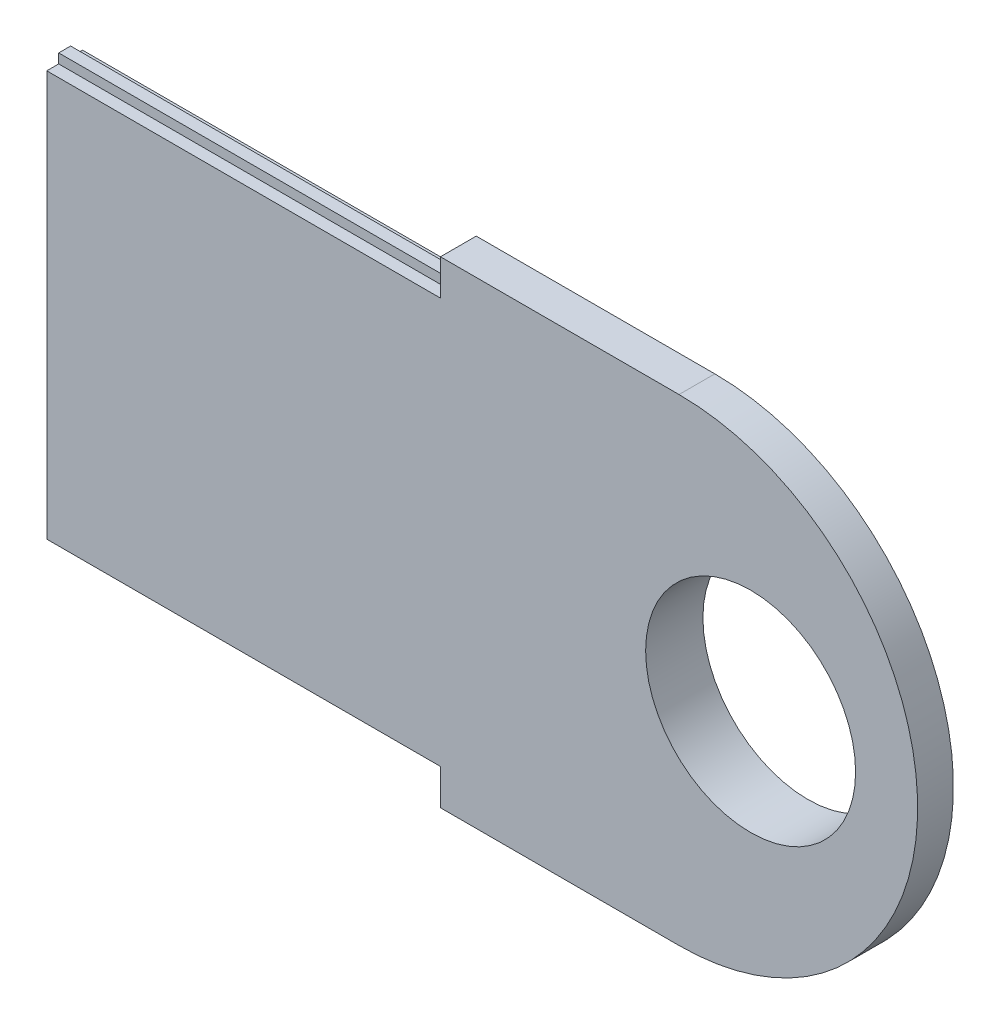
ISO-10303-21;
HEADER;
FILE_DESCRIPTION(('STEP AP214'),'2;1');
FILE_NAME('part.step','',(''),(''),'','','');
FILE_SCHEMA(('AUTOMOTIVE_DESIGN { 1 0 10303 214 1 1 1 1 }'));
ENDSEC;
DATA;
#1=APPLICATION_CONTEXT('core data for automotive mechanical design processes');
#2=APPLICATION_PROTOCOL_DEFINITION('international standard','automotive_design',2000,#1);
#3=PRODUCT_CONTEXT('',#1,'mechanical');
#4=PRODUCT('Part','Part','',(#3));
#5=PRODUCT_RELATED_PRODUCT_CATEGORY('part','',(#4));
#6=PRODUCT_DEFINITION_FORMATION('','',#4);
#7=PRODUCT_DEFINITION_CONTEXT('part definition',#1,'design');
#8=PRODUCT_DEFINITION('design','',#6,#7);
#9=PRODUCT_DEFINITION_SHAPE('','',#8);
#10=(LENGTH_UNIT() NAMED_UNIT(*) SI_UNIT(.MILLI.,.METRE.));
#11=(NAMED_UNIT(*) PLANE_ANGLE_UNIT() SI_UNIT($,.RADIAN.));
#12=(NAMED_UNIT(*) SI_UNIT($,.STERADIAN.) SOLID_ANGLE_UNIT());
#13=UNCERTAINTY_MEASURE_WITH_UNIT(LENGTH_MEASURE(1.E-05),#10,'distance_accuracy_value','');
#14=(GEOMETRIC_REPRESENTATION_CONTEXT(3) GLOBAL_UNCERTAINTY_ASSIGNED_CONTEXT((#13)) GLOBAL_UNIT_ASSIGNED_CONTEXT((#10,
#11,#12)) REPRESENTATION_CONTEXT('',''));
#15=CARTESIAN_POINT('',(0.,0.,0.));
#16=DIRECTION('',(0.,0.,1.));
#17=DIRECTION('',(1.,0.,0.));
#18=AXIS2_PLACEMENT_3D('',#15,#16,#17);
#19=CARTESIAN_POINT('',(46.355,0.,0.));
#20=DIRECTION('',(0.,0.,-1.));
#21=DIRECTION('',(-1.,0.,0.));
#22=AXIS2_PLACEMENT_3D('',#19,#20,#21);
#23=PLANE('',#22);
#24=DIRECTION('',(0.,-1.,0.));
#25=VECTOR('',#24,1.);
#26=CARTESIAN_POINT('',(-20.955,-21.59,0.));
#27=LINE('',#26,#25);
#28=CARTESIAN_POINT('',(-20.955,21.59,0.));
#29=VERTEX_POINT('',#28);
#30=CARTESIAN_POINT('',(-20.955,-21.59,0.));
#31=VERTEX_POINT('',#30);
#32=EDGE_CURVE('E215',#29,#31,#27,.T.);
#33=ORIENTED_EDGE('',*,*,#32,.F.);
#34=DIRECTION('',(-1.,0.,0.));
#35=VECTOR('',#34,1.);
#36=CARTESIAN_POINT('',(20.955,21.59,0.));
#37=LINE('',#36,#35);
#38=CARTESIAN_POINT('',(20.955,21.59,0.));
#39=VERTEX_POINT('',#38);
#40=EDGE_CURVE('E220',#39,#29,#37,.T.);
#41=ORIENTED_EDGE('',*,*,#40,.F.);
#42=DIRECTION('',(0.,-1.,0.));
#43=VECTOR('',#42,1.);
#44=CARTESIAN_POINT('',(20.955,25.4,0.));
#45=LINE('',#44,#43);
#46=CARTESIAN_POINT('',(20.955,25.4,0.));
#47=VERTEX_POINT('',#46);
#48=EDGE_CURVE('E247',#47,#39,#45,.T.);
#49=ORIENTED_EDGE('',*,*,#48,.F.);
#50=DIRECTION('',(-1.,0.,0.));
#51=VECTOR('',#50,1.);
#52=CARTESIAN_POINT('',(46.355,25.4,0.));
#53=LINE('',#52,#51);
#54=CARTESIAN_POINT('',(46.355,25.4,0.));
#55=VERTEX_POINT('',#54);
#56=EDGE_CURVE('E245',#55,#47,#53,.T.);
#57=ORIENTED_EDGE('',*,*,#56,.F.);
#58=CARTESIAN_POINT('',(46.355,0.,0.));
#59=DIRECTION('',(0.,0.,1.));
#60=DIRECTION('',(-1.,0.,0.));
#61=AXIS2_PLACEMENT_3D('',#58,#59,#60);
#62=CIRCLE('',#61,25.4);
#63=CARTESIAN_POINT('',(46.355,-25.4,0.));
#64=VERTEX_POINT('',#63);
#65=EDGE_CURVE('E243',#64,#55,#62,.T.);
#66=ORIENTED_EDGE('',*,*,#65,.F.);
#67=DIRECTION('',(1.,0.,0.));
#68=VECTOR('',#67,1.);
#69=CARTESIAN_POINT('',(46.355,-25.4,0.));
#70=LINE('',#69,#68);
#71=CARTESIAN_POINT('',(20.955,-25.4,0.));
#72=VERTEX_POINT('',#71);
#73=EDGE_CURVE('E241',#72,#64,#70,.T.);
#74=ORIENTED_EDGE('',*,*,#73,.F.);
#75=DIRECTION('',(0.,-1.,0.));
#76=VECTOR('',#75,1.);
#77=CARTESIAN_POINT('',(20.955,-25.4,0.));
#78=LINE('',#77,#76);
#79=CARTESIAN_POINT('',(20.955,-21.59,0.));
#80=VERTEX_POINT('',#79);
#81=EDGE_CURVE('E239',#80,#72,#78,.T.);
#82=ORIENTED_EDGE('',*,*,#81,.F.);
#83=DIRECTION('',(1.,0.,0.));
#84=VECTOR('',#83,1.);
#85=CARTESIAN_POINT('',(20.955,-21.59,0.));
#86=LINE('',#85,#84);
#87=EDGE_CURVE('E236',#31,#80,#86,.T.);
#88=ORIENTED_EDGE('',*,*,#87,.F.);
#89=EDGE_LOOP('',(#33,#41,#49,#57,#66,#74,#82,#88));
#90=FACE_BOUND('',#89,.T.);
#91=CARTESIAN_POINT('',(53.975,0.,0.));
#92=DIRECTION('',(0.,0.,-1.));
#93=DIRECTION('',(-1.,0.,0.));
#94=AXIS2_PLACEMENT_3D('',#91,#92,#93);
#95=CIRCLE('',#94,13.716);
#96=CARTESIAN_POINT('',(40.259,0.,0.));
#97=VERTEX_POINT('',#96);
#98=EDGE_CURVE('E386',#97,#97,#95,.T.);
#99=ORIENTED_EDGE('',*,*,#98,.F.);
#100=EDGE_LOOP('',(#99));
#101=FACE_BOUND('',#100,.T.);
#102=ADVANCED_FACE('F39',(#90,#101),#23,.T.);
#103=CARTESIAN_POINT('',(20.955,21.59,3.81));
#104=DIRECTION('',(0.,-1.,0.));
#105=DIRECTION('',(1.,0.,0.));
#106=AXIS2_PLACEMENT_3D('',#103,#104,#105);
#107=PLANE('',#106);
#108=DIRECTION('',(0.,0.,-1.));
#109=VECTOR('',#108,1.);
#110=CARTESIAN_POINT('',(20.955,21.59,3.81));
#111=LINE('',#110,#109);
#112=CARTESIAN_POINT('',(20.955,21.59,3.81));
#113=VERTEX_POINT('',#112);
#114=CARTESIAN_POINT('',(20.955,21.59,2.54));
#115=VERTEX_POINT('',#114);
#116=EDGE_CURVE('E254',#113,#115,#111,.T.);
#117=ORIENTED_EDGE('',*,*,#116,.T.);
#118=DIRECTION('',(-1.,0.,0.));
#119=VECTOR('',#118,1.);
#120=CARTESIAN_POINT('',(-20.955,21.59,2.54));
#121=LINE('',#120,#119);
#122=CARTESIAN_POINT('',(-20.955,21.59,2.54));
#123=VERTEX_POINT('',#122);
#124=EDGE_CURVE('E185',#115,#123,#121,.T.);
#125=ORIENTED_EDGE('',*,*,#124,.T.);
#126=DIRECTION('',(0.,0.,-1.));
#127=VECTOR('',#126,1.);
#128=CARTESIAN_POINT('',(-20.955,21.59,3.81));
#129=LINE('',#128,#127);
#130=CARTESIAN_POINT('',(-20.955,21.59,3.81));
#131=VERTEX_POINT('',#130);
#132=EDGE_CURVE('E161',#131,#123,#129,.T.);
#133=ORIENTED_EDGE('',*,*,#132,.F.);
#134=DIRECTION('',(-1.,0.,0.));
#135=VECTOR('',#134,1.);
#136=CARTESIAN_POINT('',(20.955,21.59,3.81));
#137=LINE('',#136,#135);
#138=EDGE_CURVE('E232',#113,#131,#137,.T.);
#139=ORIENTED_EDGE('',*,*,#138,.F.);
#140=EDGE_LOOP('',(#117,#125,#133,#139));
#141=FACE_BOUND('',#140,.T.);
#142=ADVANCED_FACE('F339',(#141),#107,.F.);
#143=CARTESIAN_POINT('',(20.955,-21.59,3.81));
#144=DIRECTION('',(0.,1.,0.));
#145=DIRECTION('',(-1.,0.,0.));
#146=AXIS2_PLACEMENT_3D('',#143,#144,#145);
#147=PLANE('',#146);
#148=DIRECTION('',(1.,0.,0.));
#149=VECTOR('',#148,1.);
#150=CARTESIAN_POINT('',(-20.955,-21.59,1.27));
#151=LINE('',#150,#149);
#152=CARTESIAN_POINT('',(-20.955,-21.59,1.27));
#153=VERTEX_POINT('',#152);
#154=CARTESIAN_POINT('',(20.955,-21.59,1.27));
#155=VERTEX_POINT('',#154);
#156=EDGE_CURVE('E165',#153,#155,#151,.T.);
#157=ORIENTED_EDGE('',*,*,#156,.F.);
#158=DIRECTION('',(0.,0.,-1.));
#159=VECTOR('',#158,1.);
#160=CARTESIAN_POINT('',(-20.955,-21.59,3.81));
#161=LINE('',#160,#159);
#162=EDGE_CURVE('E47',#153,#31,#161,.T.);
#163=ORIENTED_EDGE('',*,*,#162,.T.);
#164=ORIENTED_EDGE('',*,*,#87,.T.);
#165=DIRECTION('',(0.,0.,-1.));
#166=VECTOR('',#165,1.);
#167=CARTESIAN_POINT('',(20.955,-21.59,3.81));
#168=LINE('',#167,#166);
#169=EDGE_CURVE('E268',#155,#80,#168,.T.);
#170=ORIENTED_EDGE('',*,*,#169,.F.);
#171=EDGE_LOOP('',(#157,#163,#164,#170));
#172=FACE_BOUND('',#171,.T.);
#173=ADVANCED_FACE('F283',(#172),#147,.F.);
#174=DIRECTION('',(-1.,0.,0.));
#175=VECTOR('',#174,1.);
#176=CARTESIAN_POINT('',(-20.955,-21.59,2.54));
#177=LINE('',#176,#175);
#178=CARTESIAN_POINT('',(20.955,-21.59,2.54));
#179=VERTEX_POINT('',#178);
#180=CARTESIAN_POINT('',(-20.955,-21.59,2.54));
#181=VERTEX_POINT('',#180);
#182=EDGE_CURVE('E196',#179,#181,#177,.T.);
#183=ORIENTED_EDGE('',*,*,#182,.F.);
#184=CARTESIAN_POINT('',(20.955,-21.59,3.81));
#185=VERTEX_POINT('',#184);
#186=EDGE_CURVE('E269',#185,#179,#168,.T.);
#187=ORIENTED_EDGE('',*,*,#186,.F.);
#188=DIRECTION('',(1.,0.,0.));
#189=VECTOR('',#188,1.);
#190=CARTESIAN_POINT('',(20.955,-21.59,3.81));
#191=LINE('',#190,#189);
#192=CARTESIAN_POINT('',(-20.955,-21.59,3.81));
#193=VERTEX_POINT('',#192);
#194=EDGE_CURVE('E219',#193,#185,#191,.T.);
#195=ORIENTED_EDGE('',*,*,#194,.F.);
#196=EDGE_CURVE('E11',#193,#181,#161,.T.);
#197=ORIENTED_EDGE('',*,*,#196,.T.);
#198=EDGE_LOOP('',(#183,#187,#195,#197));
#199=FACE_BOUND('',#198,.T.);
#200=ADVANCED_FACE('F307',(#199),#147,.F.);
#201=CARTESIAN_POINT('',(20.955,-25.4,3.81));
#202=DIRECTION('',(1.,0.,0.));
#203=DIRECTION('',(0.,0.,-1.));
#204=AXIS2_PLACEMENT_3D('',#201,#202,#203);
#205=PLANE('',#204);
#206=DIRECTION('',(0.,1.,0.));
#207=VECTOR('',#206,1.);
#208=CARTESIAN_POINT('',(20.955,-22.606,1.27));
#209=LINE('',#208,#207);
#210=CARTESIAN_POINT('',(20.955,-22.606,1.27));
#211=VERTEX_POINT('',#210);
#212=EDGE_CURVE('E62',#211,#155,#209,.T.);
#213=ORIENTED_EDGE('',*,*,#212,.T.);
#214=ORIENTED_EDGE('',*,*,#169,.T.);
#215=ORIENTED_EDGE('',*,*,#81,.T.);
#216=DIRECTION('',(0.,0.,-1.));
#217=VECTOR('',#216,1.);
#218=CARTESIAN_POINT('',(20.955,-25.4,3.81));
#219=LINE('',#218,#217);
#220=CARTESIAN_POINT('',(20.955,-25.4,3.81));
#221=VERTEX_POINT('',#220);
#222=EDGE_CURVE('E266',#221,#72,#219,.T.);
#223=ORIENTED_EDGE('',*,*,#222,.F.);
#224=DIRECTION('',(0.,-1.,0.));
#225=VECTOR('',#224,1.);
#226=CARTESIAN_POINT('',(20.955,-25.4,3.81));
#227=LINE('',#226,#225);
#228=EDGE_CURVE('E222',#185,#221,#227,.T.);
#229=ORIENTED_EDGE('',*,*,#228,.F.);
#230=ORIENTED_EDGE('',*,*,#186,.T.);
#231=DIRECTION('',(0.,1.,0.));
#232=VECTOR('',#231,1.);
#233=CARTESIAN_POINT('',(20.955,-22.606,2.54));
#234=LINE('',#233,#232);
#235=CARTESIAN_POINT('',(20.955,-22.606,2.54));
#236=VERTEX_POINT('',#235);
#237=EDGE_CURVE('E207',#236,#179,#234,.T.);
#238=ORIENTED_EDGE('',*,*,#237,.F.);
#239=DIRECTION('',(0.,0.,1.));
#240=VECTOR('',#239,1.);
#241=CARTESIAN_POINT('',(20.955,-22.606,2.54));
#242=LINE('',#241,#240);
#243=EDGE_CURVE('E198',#211,#236,#242,.T.);
#244=ORIENTED_EDGE('',*,*,#243,.F.);
#245=EDGE_LOOP('',(#213,#214,#215,#223,#229,#230,#238,#244));
#246=FACE_BOUND('',#245,.T.);
#247=ADVANCED_FACE('F276',(#246),#205,.F.);
#248=CARTESIAN_POINT('',(46.355,0.,3.81));
#249=DIRECTION('',(0.,0.,-1.));
#250=DIRECTION('',(-1.,0.,0.));
#251=AXIS2_PLACEMENT_3D('',#248,#249,#250);
#252=PLANE('',#251);
#253=DIRECTION('',(0.,-1.,0.));
#254=VECTOR('',#253,1.);
#255=CARTESIAN_POINT('',(-20.955,-21.59,3.81));
#256=LINE('',#255,#254);
#257=EDGE_CURVE('E216',#131,#193,#256,.T.);
#258=ORIENTED_EDGE('',*,*,#257,.T.);
#259=ORIENTED_EDGE('',*,*,#194,.T.);
#260=ORIENTED_EDGE('',*,*,#228,.T.);
#261=DIRECTION('',(1.,0.,0.));
#262=VECTOR('',#261,1.);
#263=CARTESIAN_POINT('',(46.355,-25.4,3.81));
#264=LINE('',#263,#262);
#265=CARTESIAN_POINT('',(46.355,-25.4,3.81));
#266=VERTEX_POINT('',#265);
#267=EDGE_CURVE('E224',#221,#266,#264,.T.);
#268=ORIENTED_EDGE('',*,*,#267,.T.);
#269=CARTESIAN_POINT('',(46.355,0.,3.81));
#270=DIRECTION('',(0.,0.,1.));
#271=DIRECTION('',(-1.,0.,0.));
#272=AXIS2_PLACEMENT_3D('',#269,#270,#271);
#273=CIRCLE('',#272,25.4);
#274=CARTESIAN_POINT('',(46.355,25.4,3.81));
#275=VERTEX_POINT('',#274);
#276=EDGE_CURVE('E226',#266,#275,#273,.T.);
#277=ORIENTED_EDGE('',*,*,#276,.T.);
#278=DIRECTION('',(-1.,0.,0.));
#279=VECTOR('',#278,1.);
#280=CARTESIAN_POINT('',(46.355,25.4,3.81));
#281=LINE('',#280,#279);
#282=CARTESIAN_POINT('',(20.955,25.4,3.81));
#283=VERTEX_POINT('',#282);
#284=EDGE_CURVE('E228',#275,#283,#281,.T.);
#285=ORIENTED_EDGE('',*,*,#284,.T.);
#286=DIRECTION('',(0.,-1.,0.));
#287=VECTOR('',#286,1.);
#288=CARTESIAN_POINT('',(20.955,25.4,3.81));
#289=LINE('',#288,#287);
#290=EDGE_CURVE('E230',#283,#113,#289,.T.);
#291=ORIENTED_EDGE('',*,*,#290,.T.);
#292=ORIENTED_EDGE('',*,*,#138,.T.);
#293=EDGE_LOOP('',(#258,#259,#260,#268,#277,#285,#291,#292));
#294=FACE_BOUND('',#293,.T.);
#295=CARTESIAN_POINT('',(53.975,0.,3.81));
#296=DIRECTION('',(0.,0.,1.));
#297=DIRECTION('',(1.,0.,0.));
#298=AXIS2_PLACEMENT_3D('',#295,#296,#297);
#299=CIRCLE('',#298,11.176);
#300=CARTESIAN_POINT('',(42.799,0.,3.81));
#301=VERTEX_POINT('',#300);
#302=EDGE_CURVE('E212',#301,#301,#299,.T.);
#303=ORIENTED_EDGE('',*,*,#302,.F.);
#304=EDGE_LOOP('',(#303));
#305=FACE_BOUND('',#304,.T.);
#306=ADVANCED_FACE('F301',(#294,#305),#252,.F.);
#307=CARTESIAN_POINT('',(-20.955,-21.59,3.81));
#308=DIRECTION('',(1.,0.,0.));
#309=DIRECTION('',(0.,0.,-1.));
#310=AXIS2_PLACEMENT_3D('',#307,#308,#309);
#311=PLANE('',#310);
#312=ORIENTED_EDGE('',*,*,#32,.T.);
#313=ORIENTED_EDGE('',*,*,#162,.F.);
#314=DIRECTION('',(0.,1.,0.));
#315=VECTOR('',#314,1.);
#316=CARTESIAN_POINT('',(-20.955,-22.606,1.27));
#317=LINE('',#316,#315);
#318=CARTESIAN_POINT('',(-20.955,-22.606,1.27));
#319=VERTEX_POINT('',#318);
#320=EDGE_CURVE('E210',#319,#153,#317,.T.);
#321=ORIENTED_EDGE('',*,*,#320,.F.);
#322=DIRECTION('',(0.,0.,-1.));
#323=VECTOR('',#322,1.);
#324=CARTESIAN_POINT('',(-20.955,-22.606,2.54));
#325=LINE('',#324,#323);
#326=CARTESIAN_POINT('',(-20.955,-22.606,2.54));
#327=VERTEX_POINT('',#326);
#328=EDGE_CURVE('E192',#327,#319,#325,.T.);
#329=ORIENTED_EDGE('',*,*,#328,.F.);
#330=DIRECTION('',(0.,1.,0.));
#331=VECTOR('',#330,1.);
#332=CARTESIAN_POINT('',(-20.955,-22.606,2.54));
#333=LINE('',#332,#331);
#334=EDGE_CURVE('E202',#327,#181,#333,.T.);
#335=ORIENTED_EDGE('',*,*,#334,.T.);
#336=ORIENTED_EDGE('',*,*,#196,.F.);
#337=ORIENTED_EDGE('',*,*,#257,.F.);
#338=ORIENTED_EDGE('',*,*,#132,.T.);
#339=DIRECTION('',(0.,-1.,0.));
#340=VECTOR('',#339,1.);
#341=CARTESIAN_POINT('',(-20.955,22.606,2.54));
#342=LINE('',#341,#340);
#343=CARTESIAN_POINT('',(-20.955,22.606,2.54));
#344=VERTEX_POINT('',#343);
#345=EDGE_CURVE('E154',#344,#123,#342,.T.);
#346=ORIENTED_EDGE('',*,*,#345,.F.);
#347=DIRECTION('',(0.,0.,-1.));
#348=VECTOR('',#347,1.);
#349=CARTESIAN_POINT('',(-20.955,22.606,2.54));
#350=LINE('',#349,#348);
#351=CARTESIAN_POINT('',(-20.955,22.606,1.27));
#352=VERTEX_POINT('',#351);
#353=EDGE_CURVE('E157',#344,#352,#350,.T.);
#354=ORIENTED_EDGE('',*,*,#353,.T.);
#355=DIRECTION('',(0.,-1.,0.));
#356=VECTOR('',#355,1.);
#357=CARTESIAN_POINT('',(-20.955,22.606,1.27));
#358=LINE('',#357,#356);
#359=CARTESIAN_POINT('',(-20.955,21.59,1.27));
#360=VERTEX_POINT('',#359);
#361=EDGE_CURVE('E184',#352,#360,#358,.T.);
#362=ORIENTED_EDGE('',*,*,#361,.T.);
#363=EDGE_CURVE('E234',#360,#29,#129,.T.);
#364=ORIENTED_EDGE('',*,*,#363,.T.);
#365=EDGE_LOOP('',(#312,#313,#321,#329,#335,#336,#337,#338,#346,#354,#362,#364));
#366=FACE_BOUND('',#365,.T.);
#367=ADVANCED_FACE('F41',(#366),#311,.F.);
#368=CARTESIAN_POINT('',(46.355,-25.4,3.81));
#369=DIRECTION('',(0.,1.,0.));
#370=DIRECTION('',(-1.,0.,0.));
#371=AXIS2_PLACEMENT_3D('',#368,#369,#370);
#372=PLANE('',#371);
#373=ORIENTED_EDGE('',*,*,#73,.T.);
#374=DIRECTION('',(0.,0.,-1.));
#375=VECTOR('',#374,1.);
#376=CARTESIAN_POINT('',(46.355,-25.4,3.81));
#377=LINE('',#376,#375);
#378=EDGE_CURVE('E263',#266,#64,#377,.T.);
#379=ORIENTED_EDGE('',*,*,#378,.F.);
#380=ORIENTED_EDGE('',*,*,#267,.F.);
#381=ORIENTED_EDGE('',*,*,#222,.T.);
#382=EDGE_LOOP('',(#373,#379,#380,#381));
#383=FACE_BOUND('',#382,.T.);
#384=ADVANCED_FACE('F293',(#383),#372,.F.);
#385=CARTESIAN_POINT('',(46.355,0.,3.81));
#386=DIRECTION('',(0.,0.,-1.));
#387=DIRECTION('',(-1.,0.,0.));
#388=AXIS2_PLACEMENT_3D('',#385,#386,#387);
#389=CYLINDRICAL_SURFACE('',#388,25.4);
#390=ORIENTED_EDGE('',*,*,#65,.T.);
#391=DIRECTION('',(0.,0.,-1.));
#392=VECTOR('',#391,1.);
#393=CARTESIAN_POINT('',(46.355,25.4,3.81));
#394=LINE('',#393,#392);
#395=EDGE_CURVE('E260',#275,#55,#394,.T.);
#396=ORIENTED_EDGE('',*,*,#395,.F.);
#397=ORIENTED_EDGE('',*,*,#276,.F.);
#398=ORIENTED_EDGE('',*,*,#378,.T.);
#399=EDGE_LOOP('',(#390,#396,#397,#398));
#400=FACE_BOUND('',#399,.T.);
#401=ADVANCED_FACE('F297',(#400),#389,.T.);
#402=CARTESIAN_POINT('',(46.355,25.4,3.81));
#403=DIRECTION('',(0.,-1.,0.));
#404=DIRECTION('',(1.,0.,0.));
#405=AXIS2_PLACEMENT_3D('',#402,#403,#404);
#406=PLANE('',#405);
#407=ORIENTED_EDGE('',*,*,#56,.T.);
#408=DIRECTION('',(0.,0.,-1.));
#409=VECTOR('',#408,1.);
#410=CARTESIAN_POINT('',(20.955,25.4,3.81));
#411=LINE('',#410,#409);
#412=EDGE_CURVE('E257',#283,#47,#411,.T.);
#413=ORIENTED_EDGE('',*,*,#412,.F.);
#414=ORIENTED_EDGE('',*,*,#284,.F.);
#415=ORIENTED_EDGE('',*,*,#395,.T.);
#416=EDGE_LOOP('',(#407,#413,#414,#415));
#417=FACE_BOUND('',#416,.T.);
#418=ADVANCED_FACE('F328',(#417),#406,.F.);
#419=CARTESIAN_POINT('',(20.955,25.4,3.81));
#420=DIRECTION('',(1.,0.,0.));
#421=DIRECTION('',(0.,0.,-1.));
#422=AXIS2_PLACEMENT_3D('',#419,#420,#421);
#423=PLANE('',#422);
#424=DIRECTION('',(0.,0.,1.));
#425=VECTOR('',#424,1.);
#426=CARTESIAN_POINT('',(20.955,22.606,2.54));
#427=LINE('',#426,#425);
#428=CARTESIAN_POINT('',(20.955,22.606,1.27));
#429=VERTEX_POINT('',#428);
#430=CARTESIAN_POINT('',(20.955,22.606,2.54));
#431=VERTEX_POINT('',#430);
#432=EDGE_CURVE('E178',#429,#431,#427,.T.);
#433=ORIENTED_EDGE('',*,*,#432,.T.);
#434=DIRECTION('',(0.,-1.,0.));
#435=VECTOR('',#434,1.);
#436=CARTESIAN_POINT('',(20.955,22.606,2.54));
#437=LINE('',#436,#435);
#438=EDGE_CURVE('E166',#431,#115,#437,.T.);
#439=ORIENTED_EDGE('',*,*,#438,.T.);
#440=ORIENTED_EDGE('',*,*,#116,.F.);
#441=ORIENTED_EDGE('',*,*,#290,.F.);
#442=ORIENTED_EDGE('',*,*,#412,.T.);
#443=ORIENTED_EDGE('',*,*,#48,.T.);
#444=CARTESIAN_POINT('',(20.955,21.59,1.27));
#445=VERTEX_POINT('',#444);
#446=EDGE_CURVE('E253',#445,#39,#111,.T.);
#447=ORIENTED_EDGE('',*,*,#446,.F.);
#448=DIRECTION('',(0.,-1.,0.));
#449=VECTOR('',#448,1.);
#450=CARTESIAN_POINT('',(20.955,22.606,1.27));
#451=LINE('',#450,#449);
#452=EDGE_CURVE('E54',#429,#445,#451,.T.);
#453=ORIENTED_EDGE('',*,*,#452,.F.);
#454=EDGE_LOOP('',(#433,#439,#440,#441,#442,#443,#447,#453));
#455=FACE_BOUND('',#454,.T.);
#456=ADVANCED_FACE('F324',(#455),#423,.F.);
#457=ORIENTED_EDGE('',*,*,#363,.F.);
#458=DIRECTION('',(1.,0.,0.));
#459=VECTOR('',#458,1.);
#460=CARTESIAN_POINT('',(-20.955,21.59,1.27));
#461=LINE('',#460,#459);
#462=EDGE_CURVE('E174',#360,#445,#461,.T.);
#463=ORIENTED_EDGE('',*,*,#462,.T.);
#464=ORIENTED_EDGE('',*,*,#446,.T.);
#465=ORIENTED_EDGE('',*,*,#40,.T.);
#466=EDGE_LOOP('',(#457,#463,#464,#465));
#467=FACE_BOUND('',#466,.T.);
#468=ADVANCED_FACE('F321',(#467),#107,.F.);
#469=CARTESIAN_POINT('',(53.975,0.,3.81));
#470=DIRECTION('',(0.,0.,-1.));
#471=DIRECTION('',(-1.,0.,0.));
#472=AXIS2_PLACEMENT_3D('',#469,#470,#471);
#473=CYLINDRICAL_SURFACE('',#472,11.176);
#474=CARTESIAN_POINT('',(53.975,0.,-2.286));
#475=DIRECTION('',(0.,0.,-1.));
#476=DIRECTION('',(-1.,0.,0.));
#477=AXIS2_PLACEMENT_3D('',#474,#475,#476);
#478=CIRCLE('',#477,11.176);
#479=CARTESIAN_POINT('',(42.799,0.,-2.286));
#480=VERTEX_POINT('',#479);
#481=EDGE_CURVE('E385',#480,#480,#478,.T.);
#482=CARTESIAN_POINT('',(42.799,0.,3.81));
#483=CARTESIAN_POINT('',(42.799,0.,3.7465));
#484=CARTESIAN_POINT('',(42.799,0.,3.683));
#485=CARTESIAN_POINT('',(42.799,0.,3.556));
#486=CARTESIAN_POINT('',(42.799,0.,3.4925));
#487=CARTESIAN_POINT('',(42.799,0.,3.3655));
#488=CARTESIAN_POINT('',(42.799,0.,3.302));
#489=CARTESIAN_POINT('',(42.799,0.,3.175));
#490=CARTESIAN_POINT('',(42.799,0.,3.1115));
#491=CARTESIAN_POINT('',(42.799,0.,2.9845));
#492=CARTESIAN_POINT('',(42.799,0.,2.921));
#493=CARTESIAN_POINT('',(42.799,0.,2.794));
#494=CARTESIAN_POINT('',(42.799,0.,2.7305));
#495=CARTESIAN_POINT('',(42.799,0.,2.6035));
#496=CARTESIAN_POINT('',(42.799,0.,2.54));
#497=CARTESIAN_POINT('',(42.799,0.,2.413));
#498=CARTESIAN_POINT('',(42.799,0.,2.3495));
#499=CARTESIAN_POINT('',(42.799,0.,2.2225));
#500=CARTESIAN_POINT('',(42.799,0.,2.159));
#501=CARTESIAN_POINT('',(42.799,0.,2.032));
#502=CARTESIAN_POINT('',(42.799,0.,1.9685));
#503=CARTESIAN_POINT('',(42.799,0.,1.8415));
#504=CARTESIAN_POINT('',(42.799,0.,1.778));
#505=CARTESIAN_POINT('',(42.799,0.,1.651));
#506=CARTESIAN_POINT('',(42.799,0.,1.5875));
#507=CARTESIAN_POINT('',(42.799,0.,1.4605));
#508=CARTESIAN_POINT('',(42.799,0.,1.397));
#509=CARTESIAN_POINT('',(42.799,0.,1.27));
#510=CARTESIAN_POINT('',(42.799,0.,1.2065));
#511=CARTESIAN_POINT('',(42.799,0.,1.0795));
#512=CARTESIAN_POINT('',(42.799,0.,1.016));
#513=CARTESIAN_POINT('',(42.799,0.,0.888999999999999));
#514=CARTESIAN_POINT('',(42.799,0.,0.825499999999999));
#515=CARTESIAN_POINT('',(42.799,0.,0.698499999999999));
#516=CARTESIAN_POINT('',(42.799,0.,0.634999999999999));
#517=CARTESIAN_POINT('',(42.799,0.,0.507999999999999));
#518=CARTESIAN_POINT('',(42.799,0.,0.444499999999999));
#519=CARTESIAN_POINT('',(42.799,0.,0.317499999999999));
#520=CARTESIAN_POINT('',(42.799,0.,0.253999999999999));
#521=CARTESIAN_POINT('',(42.799,0.,0.126999999999999));
#522=CARTESIAN_POINT('',(42.799,0.,0.0634999999999992));
#523=CARTESIAN_POINT('',(42.799,0.,-0.0635000000000006));
#524=CARTESIAN_POINT('',(42.799,0.,-0.127));
#525=CARTESIAN_POINT('',(42.799,0.,-0.254));
#526=CARTESIAN_POINT('',(42.799,0.,-0.3175));
#527=CARTESIAN_POINT('',(42.799,0.,-0.4445));
#528=CARTESIAN_POINT('',(42.799,0.,-0.508));
#529=CARTESIAN_POINT('',(42.799,0.,-0.635));
#530=CARTESIAN_POINT('',(42.799,0.,-0.6985));
#531=CARTESIAN_POINT('',(42.799,0.,-0.8255));
#532=CARTESIAN_POINT('',(42.799,0.,-0.889));
#533=CARTESIAN_POINT('',(42.799,0.,-1.016));
#534=CARTESIAN_POINT('',(42.799,0.,-1.0795));
#535=CARTESIAN_POINT('',(42.799,0.,-1.2065));
#536=CARTESIAN_POINT('',(42.799,0.,-1.27));
#537=CARTESIAN_POINT('',(42.799,0.,-1.397));
#538=CARTESIAN_POINT('',(42.799,0.,-1.4605));
#539=CARTESIAN_POINT('',(42.799,0.,-1.5875));
#540=CARTESIAN_POINT('',(42.799,0.,-1.651));
#541=CARTESIAN_POINT('',(42.799,0.,-1.778));
#542=CARTESIAN_POINT('',(42.799,0.,-1.8415));
#543=CARTESIAN_POINT('',(42.799,0.,-1.9685));
#544=CARTESIAN_POINT('',(42.799,0.,-2.032));
#545=CARTESIAN_POINT('',(42.799,0.,-2.159));
#546=CARTESIAN_POINT('',(42.799,0.,-2.2225));
#547=CARTESIAN_POINT('',(42.799,0.,-2.286));
#548=B_SPLINE_CURVE_WITH_KNOTS('',3,(#482,#483,#484,#485,#486,#487,#488,#489,#490,#491,#492,
#493,#494,#495,#496,#497,#498,#499,#500,#501,#502,#503,#504,#505,#506,#507,#508,#509,#510,#511,
#512,#513,#514,#515,#516,#517,#518,#519,#520,#521,#522,#523,#524,#525,#526,#527,#528,#529,#530,
#531,#532,#533,#534,#535,#536,#537,#538,#539,#540,#541,#542,#543,#544,#545,#546,#547),
.UNSPECIFIED.,.F.,.F.,(4,2,2,2,2,2,2,2,2,2,2,2,2,2,2,2,2,2,2,2,2,2,2,2,2,2,2,2,2,2,2,2,4),(0.,
0.1905,0.381,0.5715,0.762,0.9525,1.143,1.3335,1.524,1.7145,1.905,2.0955,2.286,2.4765,2.667,
2.8575,3.048,3.2385,3.429,3.6195,3.81,4.0005,4.191,4.3815,4.572,4.7625,4.953,5.1435,5.334,
5.5245,5.715,5.9055,6.096),.UNSPECIFIED.);
#549=EDGE_CURVE('BSEAM351',#301,#480,#548,.T.);
#550=ORIENTED_EDGE('',*,*,#302,.T.);
#551=ORIENTED_EDGE('',*,*,#481,.T.);
#552=ORIENTED_EDGE('',*,*,#549,.T.);
#553=ORIENTED_EDGE('',*,*,#549,.F.);
#554=EDGE_LOOP('',(#550,#552,#551,#553));
#555=FACE_BOUND('',#554,.T.);
#556=ADVANCED_FACE('F351',(#555),#473,.F.);
#557=CARTESIAN_POINT('',(-20.955,-22.606,1.27));
#558=DIRECTION('',(0.,0.,1.));
#559=DIRECTION('',(1.,0.,0.));
#560=AXIS2_PLACEMENT_3D('',#557,#558,#559);
#561=PLANE('',#560);
#562=ORIENTED_EDGE('',*,*,#156,.T.);
#563=ORIENTED_EDGE('',*,*,#212,.F.);
#564=DIRECTION('',(1.,0.,0.));
#565=VECTOR('',#564,1.);
#566=CARTESIAN_POINT('',(-20.955,-22.606,1.27));
#567=LINE('',#566,#565);
#568=EDGE_CURVE('E195',#319,#211,#567,.T.);
#569=ORIENTED_EDGE('',*,*,#568,.F.);
#570=ORIENTED_EDGE('',*,*,#320,.T.);
#571=EDGE_LOOP('',(#562,#563,#569,#570));
#572=FACE_BOUND('',#571,.T.);
#573=ADVANCED_FACE('F316',(#572),#561,.F.);
#574=CARTESIAN_POINT('',(-20.955,-22.606,2.54));
#575=DIRECTION('',(0.,0.,-1.));
#576=DIRECTION('',(-1.,0.,0.));
#577=AXIS2_PLACEMENT_3D('',#574,#575,#576);
#578=PLANE('',#577);
#579=ORIENTED_EDGE('',*,*,#182,.T.);
#580=ORIENTED_EDGE('',*,*,#334,.F.);
#581=DIRECTION('',(-1.,0.,0.));
#582=VECTOR('',#581,1.);
#583=CARTESIAN_POINT('',(-20.955,-22.606,2.54));
#584=LINE('',#583,#582);
#585=EDGE_CURVE('E200',#236,#327,#584,.T.);
#586=ORIENTED_EDGE('',*,*,#585,.F.);
#587=ORIENTED_EDGE('',*,*,#237,.T.);
#588=EDGE_LOOP('',(#579,#580,#586,#587));
#589=FACE_BOUND('',#588,.T.);
#590=ADVANCED_FACE('F310',(#589),#578,.F.);
#591=CARTESIAN_POINT('',(0.,-22.606,0.));
#592=DIRECTION('',(0.,-1.,0.));
#593=DIRECTION('',(1.,0.,0.));
#594=AXIS2_PLACEMENT_3D('',#591,#592,#593);
#595=PLANE('',#594);
#596=ORIENTED_EDGE('',*,*,#328,.T.);
#597=ORIENTED_EDGE('',*,*,#568,.T.);
#598=ORIENTED_EDGE('',*,*,#243,.T.);
#599=ORIENTED_EDGE('',*,*,#585,.T.);
#600=EDGE_LOOP('',(#596,#597,#598,#599));
#601=FACE_BOUND('',#600,.T.);
#602=ADVANCED_FACE('F315',(#601),#595,.T.);
#603=CARTESIAN_POINT('',(-20.955,22.606,2.54));
#604=DIRECTION('',(0.,0.,1.));
#605=DIRECTION('',(1.,0.,0.));
#606=AXIS2_PLACEMENT_3D('',#603,#604,#605);
#607=PLANE('',#606);
#608=ORIENTED_EDGE('',*,*,#124,.F.);
#609=ORIENTED_EDGE('',*,*,#438,.F.);
#610=DIRECTION('',(-1.,0.,0.));
#611=VECTOR('',#610,1.);
#612=CARTESIAN_POINT('',(-20.955,22.606,2.54));
#613=LINE('',#612,#611);
#614=EDGE_CURVE('E171',#431,#344,#613,.T.);
#615=ORIENTED_EDGE('',*,*,#614,.T.);
#616=ORIENTED_EDGE('',*,*,#345,.T.);
#617=EDGE_LOOP('',(#608,#609,#615,#616));
#618=FACE_BOUND('',#617,.T.);
#619=ADVANCED_FACE('F176',(#618),#607,.T.);
#620=CARTESIAN_POINT('',(-20.955,22.606,1.27));
#621=DIRECTION('',(0.,0.,-1.));
#622=DIRECTION('',(-1.,0.,0.));
#623=AXIS2_PLACEMENT_3D('',#620,#621,#622);
#624=PLANE('',#623);
#625=ORIENTED_EDGE('',*,*,#462,.F.);
#626=ORIENTED_EDGE('',*,*,#361,.F.);
#627=DIRECTION('',(1.,0.,0.));
#628=VECTOR('',#627,1.);
#629=CARTESIAN_POINT('',(-20.955,22.606,1.27));
#630=LINE('',#629,#628);
#631=EDGE_CURVE('E173',#352,#429,#630,.T.);
#632=ORIENTED_EDGE('',*,*,#631,.T.);
#633=ORIENTED_EDGE('',*,*,#452,.T.);
#634=EDGE_LOOP('',(#625,#626,#632,#633));
#635=FACE_BOUND('',#634,.T.);
#636=ADVANCED_FACE('F368',(#635),#624,.T.);
#637=CARTESIAN_POINT('',(0.,22.606,0.));
#638=DIRECTION('',(0.,1.,0.));
#639=DIRECTION('',(1.,0.,0.));
#640=AXIS2_PLACEMENT_3D('',#637,#638,#639);
#641=PLANE('',#640);
#642=ORIENTED_EDGE('',*,*,#353,.F.);
#643=ORIENTED_EDGE('',*,*,#614,.F.);
#644=ORIENTED_EDGE('',*,*,#432,.F.);
#645=ORIENTED_EDGE('',*,*,#631,.F.);
#646=EDGE_LOOP('',(#642,#643,#644,#645));
#647=FACE_BOUND('',#646,.T.);
#648=ADVANCED_FACE('F170',(#647),#641,.T.);
#649=CARTESIAN_POINT('',(53.975,0.,-2.286));
#650=DIRECTION('',(0.,0.,-1.));
#651=DIRECTION('',(-1.,0.,0.));
#652=AXIS2_PLACEMENT_3D('',#649,#650,#651);
#653=PLANE('',#652);
#654=CARTESIAN_POINT('',(53.975,0.,-2.286));
#655=DIRECTION('',(0.,0.,-1.));
#656=DIRECTION('',(-1.,0.,0.));
#657=AXIS2_PLACEMENT_3D('',#654,#655,#656);
#658=CIRCLE('',#657,13.716);
#659=CARTESIAN_POINT('',(40.259,0.,-2.286));
#660=VERTEX_POINT('',#659);
#661=EDGE_CURVE('E187',#660,#660,#658,.T.);
#662=ORIENTED_EDGE('',*,*,#661,.T.);
#663=EDGE_LOOP('',(#662));
#664=FACE_BOUND('',#663,.T.);
#665=ORIENTED_EDGE('',*,*,#481,.F.);
#666=EDGE_LOOP('',(#665));
#667=FACE_BOUND('',#666,.T.);
#668=ADVANCED_FACE('F372',(#664,#667),#653,.T.);
#669=CARTESIAN_POINT('',(53.975,0.,-2.286));
#670=DIRECTION('',(0.,0.,1.));
#671=DIRECTION('',(1.,0.,0.));
#672=AXIS2_PLACEMENT_3D('',#669,#670,#671);
#673=CYLINDRICAL_SURFACE('',#672,13.716);
#674=ORIENTED_EDGE('',*,*,#661,.F.);
#675=EDGE_LOOP('',(#674));
#676=FACE_BOUND('',#675,.T.);
#677=ORIENTED_EDGE('',*,*,#98,.T.);
#678=EDGE_LOOP('',(#677));
#679=FACE_BOUND('',#678,.T.);
#680=ADVANCED_FACE('F373',(#676,#679),#673,.T.);
#681=CLOSED_SHELL('',(#102,#142,#173,#200,#247,#306,#367,#384,#401,#418,#456,#468,#556,#573,
#590,#602,#619,#636,#648,#668,#680));
#682=MANIFOLD_SOLID_BREP('B2',#681);
#683=ADVANCED_BREP_SHAPE_REPRESENTATION('',(#18,#682),#14);
#684=SHAPE_DEFINITION_REPRESENTATION(#9,#683);
ENDSEC;
END-ISO-10303-21;
